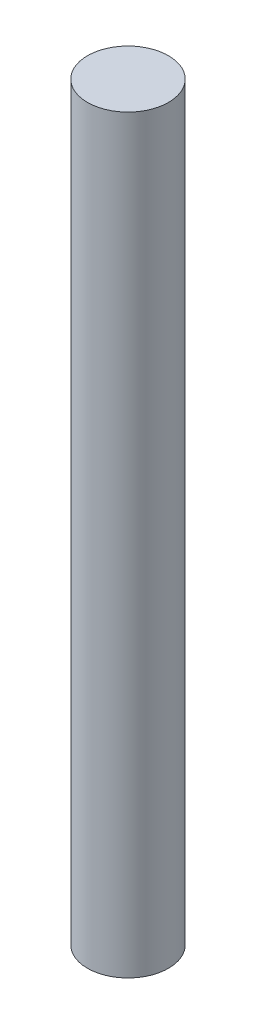
ISO-10303-21;
HEADER;
FILE_DESCRIPTION(('STEP AP214'),'2;1');
FILE_NAME('part.step','',(''),(''),'','','');
FILE_SCHEMA(('AUTOMOTIVE_DESIGN { 1 0 10303 214 1 1 1 1 }'));
ENDSEC;
DATA;
#1=APPLICATION_CONTEXT('core data for automotive mechanical design processes');
#2=APPLICATION_PROTOCOL_DEFINITION('international standard','automotive_design',2000,#1);
#3=PRODUCT_CONTEXT('',#1,'mechanical');
#4=PRODUCT('Part','Part','',(#3));
#5=PRODUCT_RELATED_PRODUCT_CATEGORY('part','',(#4));
#6=PRODUCT_DEFINITION_FORMATION('','',#4);
#7=PRODUCT_DEFINITION_CONTEXT('part definition',#1,'design');
#8=PRODUCT_DEFINITION('design','',#6,#7);
#9=PRODUCT_DEFINITION_SHAPE('','',#8);
#10=(LENGTH_UNIT() NAMED_UNIT(*) SI_UNIT(.MILLI.,.METRE.));
#11=(NAMED_UNIT(*) PLANE_ANGLE_UNIT() SI_UNIT($,.RADIAN.));
#12=(NAMED_UNIT(*) SI_UNIT($,.STERADIAN.) SOLID_ANGLE_UNIT());
#13=UNCERTAINTY_MEASURE_WITH_UNIT(LENGTH_MEASURE(1.E-05),#10,'distance_accuracy_value','');
#14=(GEOMETRIC_REPRESENTATION_CONTEXT(3) GLOBAL_UNCERTAINTY_ASSIGNED_CONTEXT((#13)) GLOBAL_UNIT_ASSIGNED_CONTEXT((#10,
#11,#12)) REPRESENTATION_CONTEXT('',''));
#15=CARTESIAN_POINT('',(0.,0.,0.));
#16=DIRECTION('',(0.,0.,1.));
#17=DIRECTION('',(1.,0.,0.));
#18=AXIS2_PLACEMENT_3D('',#15,#16,#17);
#19=CARTESIAN_POINT('',(0.,25.,0.));
#20=DIRECTION('',(0.,-1.,0.));
#21=DIRECTION('',(0.,0.,-1.));
#22=AXIS2_PLACEMENT_3D('',#19,#20,#21);
#23=CYLINDRICAL_SURFACE('',#22,1.35);
#24=CARTESIAN_POINT('',(0.,25.,0.));
#25=DIRECTION('',(0.,1.,0.));
#26=DIRECTION('',(0.,0.,1.));
#27=AXIS2_PLACEMENT_3D('',#24,#25,#26);
#28=CIRCLE('',#27,1.35);
#29=CARTESIAN_POINT('',(0.,25.,1.35));
#30=VERTEX_POINT('',#29);
#31=EDGE_CURVE('E10',#30,#30,#28,.T.);
#32=ORIENTED_EDGE('',*,*,#31,.F.);
#33=EDGE_LOOP('',(#32));
#34=FACE_BOUND('',#33,.T.);
#35=CARTESIAN_POINT('',(0.,0.,0.));
#36=DIRECTION('',(0.,1.,0.));
#37=DIRECTION('',(0.,0.,1.));
#38=AXIS2_PLACEMENT_3D('',#35,#36,#37);
#39=CIRCLE('',#38,1.35);
#40=CARTESIAN_POINT('',(0.,0.,1.35));
#41=VERTEX_POINT('',#40);
#42=EDGE_CURVE('E40',#41,#41,#39,.T.);
#43=ORIENTED_EDGE('',*,*,#42,.T.);
#44=EDGE_LOOP('',(#43));
#45=FACE_BOUND('',#44,.T.);
#46=ADVANCED_FACE('F37',(#34,#45),#23,.T.);
#47=CARTESIAN_POINT('',(0.,25.,0.));
#48=DIRECTION('',(0.,1.,0.));
#49=DIRECTION('',(0.,0.,1.));
#50=AXIS2_PLACEMENT_3D('',#47,#48,#49);
#51=PLANE('',#50);
#52=ORIENTED_EDGE('',*,*,#31,.T.);
#53=EDGE_LOOP('',(#52));
#54=FACE_BOUND('',#53,.T.);
#55=ADVANCED_FACE('F52',(#54),#51,.T.);
#56=CARTESIAN_POINT('',(0.,0.,0.));
#57=DIRECTION('',(0.,1.,0.));
#58=DIRECTION('',(0.,0.,1.));
#59=AXIS2_PLACEMENT_3D('',#56,#57,#58);
#60=PLANE('',#59);
#61=ORIENTED_EDGE('',*,*,#42,.F.);
#62=EDGE_LOOP('',(#61));
#63=FACE_BOUND('',#62,.T.);
#64=ADVANCED_FACE('F50',(#63),#60,.F.);
#65=CLOSED_SHELL('',(#46,#55,#64));
#66=MANIFOLD_SOLID_BREP('B2',#65);
#67=ADVANCED_BREP_SHAPE_REPRESENTATION('',(#18,#66),#14);
#68=SHAPE_DEFINITION_REPRESENTATION(#9,#67);
ENDSEC;
END-ISO-10303-21;
